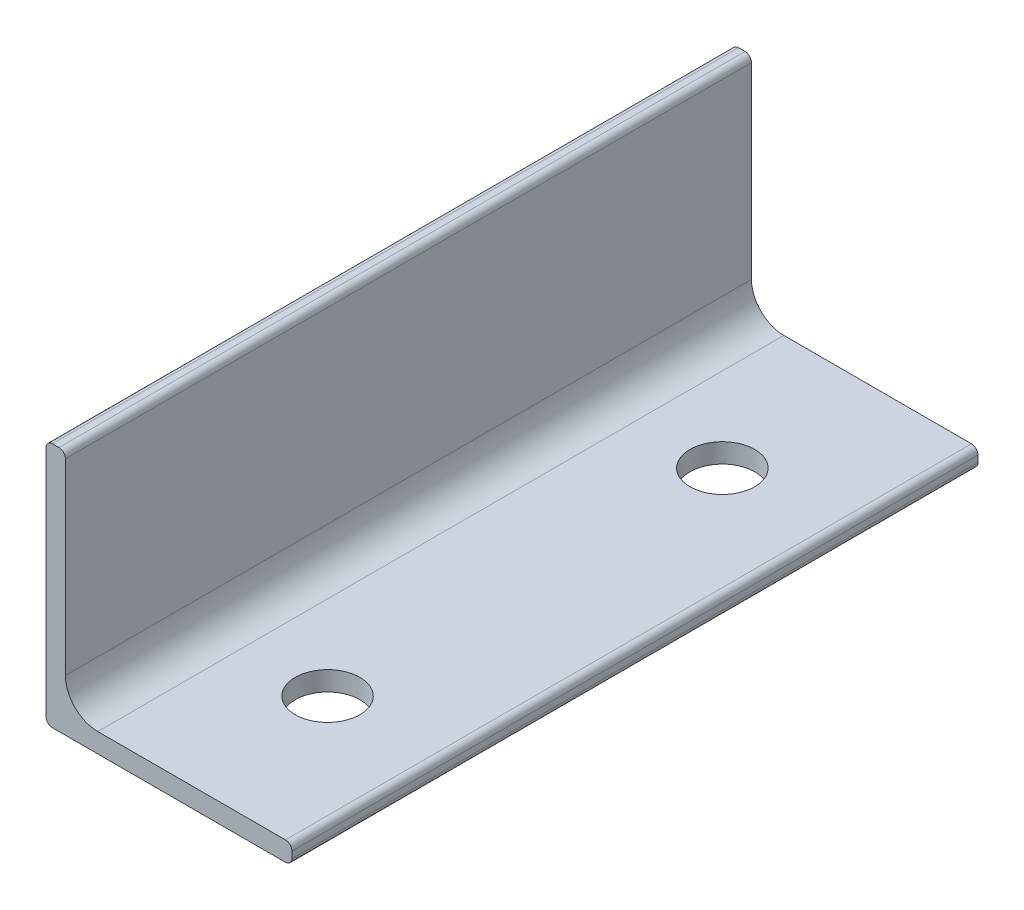
ISO-10303-21;
HEADER;
FILE_DESCRIPTION(('STEP AP214'),'2;1');
FILE_NAME('part.step','',(''),(''),'','','');
FILE_SCHEMA(('AUTOMOTIVE_DESIGN { 1 0 10303 214 1 1 1 1 }'));
ENDSEC;
DATA;
#1=APPLICATION_CONTEXT('core data for automotive mechanical design processes');
#2=APPLICATION_PROTOCOL_DEFINITION('international standard','automotive_design',2000,#1);
#3=PRODUCT_CONTEXT('',#1,'mechanical');
#4=PRODUCT('Part','Part','',(#3));
#5=PRODUCT_RELATED_PRODUCT_CATEGORY('part','',(#4));
#6=PRODUCT_DEFINITION_FORMATION('','',#4);
#7=PRODUCT_DEFINITION_CONTEXT('part definition',#1,'design');
#8=PRODUCT_DEFINITION('design','',#6,#7);
#9=PRODUCT_DEFINITION_SHAPE('','',#8);
#10=(LENGTH_UNIT() NAMED_UNIT(*) SI_UNIT(.MILLI.,.METRE.));
#11=(NAMED_UNIT(*) PLANE_ANGLE_UNIT() SI_UNIT($,.RADIAN.));
#12=(NAMED_UNIT(*) SI_UNIT($,.STERADIAN.) SOLID_ANGLE_UNIT());
#13=UNCERTAINTY_MEASURE_WITH_UNIT(LENGTH_MEASURE(1.E-05),#10,'distance_accuracy_value','');
#14=(GEOMETRIC_REPRESENTATION_CONTEXT(3) GLOBAL_UNCERTAINTY_ASSIGNED_CONTEXT((#13)) GLOBAL_UNIT_ASSIGNED_CONTEXT((#10,
#11,#12)) REPRESENTATION_CONTEXT('',''));
#15=CARTESIAN_POINT('',(0.,0.,0.));
#16=DIRECTION('',(0.,0.,1.));
#17=DIRECTION('',(1.,0.,0.));
#18=AXIS2_PLACEMENT_3D('',#15,#16,#17);
#19=CARTESIAN_POINT('',(8.,8.,53.));
#20=DIRECTION('',(0.,0.,-1.));
#21=DIRECTION('',(-1.,0.,0.));
#22=AXIS2_PLACEMENT_3D('',#19,#20,#21);
#23=CYLINDRICAL_SURFACE('',#22,5.);
#24=CARTESIAN_POINT('',(8.,8.,-53.));
#25=DIRECTION('',(0.,0.,-1.));
#26=DIRECTION('',(1.,0.,0.));
#27=AXIS2_PLACEMENT_3D('',#24,#25,#26);
#28=CIRCLE('',#27,5.);
#29=CARTESIAN_POINT('',(8.00000000000004,3.,-53.));
#30=VERTEX_POINT('',#29);
#31=CARTESIAN_POINT('',(3.,8.00000000000004,-53.));
#32=VERTEX_POINT('',#31);
#33=EDGE_CURVE('E170',#30,#32,#28,.T.);
#34=ORIENTED_EDGE('',*,*,#33,.T.);
#35=DIRECTION('',(0.,0.,-1.));
#36=VECTOR('',#35,1.);
#37=CARTESIAN_POINT('',(3.,8.00000000000004,53.));
#38=LINE('',#37,#36);
#39=CARTESIAN_POINT('',(3.,8.00000000000004,53.));
#40=VERTEX_POINT('',#39);
#41=EDGE_CURVE('E11',#40,#32,#38,.T.);
#42=ORIENTED_EDGE('',*,*,#41,.F.);
#43=CARTESIAN_POINT('',(8.,8.,53.));
#44=DIRECTION('',(0.,0.,-1.));
#45=DIRECTION('',(1.,0.,0.));
#46=AXIS2_PLACEMENT_3D('',#43,#44,#45);
#47=CIRCLE('',#46,5.);
#48=CARTESIAN_POINT('',(8.00000000000004,3.,53.));
#49=VERTEX_POINT('',#48);
#50=EDGE_CURVE('E205',#49,#40,#47,.T.);
#51=ORIENTED_EDGE('',*,*,#50,.F.);
#52=DIRECTION('',(0.,0.,-1.));
#53=VECTOR('',#52,1.);
#54=CARTESIAN_POINT('',(8.00000000000004,3.,53.));
#55=LINE('',#54,#53);
#56=EDGE_CURVE('E166',#49,#30,#55,.T.);
#57=ORIENTED_EDGE('',*,*,#56,.T.);
#58=EDGE_LOOP('',(#34,#42,#51,#57));
#59=FACE_BOUND('',#58,.T.);
#60=ADVANCED_FACE('F45',(#59),#23,.F.);
#61=CARTESIAN_POINT('',(3.,37.,53.));
#62=DIRECTION('',(-1.,0.,0.));
#63=DIRECTION('',(0.,-1.,0.));
#64=AXIS2_PLACEMENT_3D('',#61,#62,#63);
#65=PLANE('',#64);
#66=DIRECTION('',(0.,1.,0.));
#67=VECTOR('',#66,1.);
#68=CARTESIAN_POINT('',(3.,37.,-53.));
#69=LINE('',#68,#67);
#70=CARTESIAN_POINT('',(3.,37.,-53.));
#71=VERTEX_POINT('',#70);
#72=EDGE_CURVE('E174',#32,#71,#69,.T.);
#73=ORIENTED_EDGE('',*,*,#72,.T.);
#74=DIRECTION('',(0.,0.,-1.));
#75=VECTOR('',#74,1.);
#76=CARTESIAN_POINT('',(3.,37.,53.));
#77=LINE('',#76,#75);
#78=CARTESIAN_POINT('',(3.,37.,53.));
#79=VERTEX_POINT('',#78);
#80=EDGE_CURVE('E54',#79,#71,#77,.T.);
#81=ORIENTED_EDGE('',*,*,#80,.F.);
#82=DIRECTION('',(0.,1.,0.));
#83=VECTOR('',#82,1.);
#84=CARTESIAN_POINT('',(3.,37.,53.));
#85=LINE('',#84,#83);
#86=EDGE_CURVE('E117',#40,#79,#85,.T.);
#87=ORIENTED_EDGE('',*,*,#86,.F.);
#88=ORIENTED_EDGE('',*,*,#41,.T.);
#89=EDGE_LOOP('',(#73,#81,#87,#88));
#90=FACE_BOUND('',#89,.T.);
#91=ADVANCED_FACE('F304',(#90),#65,.F.);
#92=CARTESIAN_POINT('',(2.,37.,53.));
#93=DIRECTION('',(0.,0.,-1.));
#94=DIRECTION('',(-1.,0.,0.));
#95=AXIS2_PLACEMENT_3D('',#92,#93,#94);
#96=CYLINDRICAL_SURFACE('',#95,1.);
#97=CARTESIAN_POINT('',(2.,37.,-53.));
#98=DIRECTION('',(0.,0.,1.));
#99=DIRECTION('',(-1.,0.,0.));
#100=AXIS2_PLACEMENT_3D('',#97,#98,#99);
#101=CIRCLE('',#100,1.);
#102=CARTESIAN_POINT('',(1.99999999999999,38.,-53.));
#103=VERTEX_POINT('',#102);
#104=EDGE_CURVE('E178',#71,#103,#101,.T.);
#105=ORIENTED_EDGE('',*,*,#104,.T.);
#106=DIRECTION('',(0.,0.,-1.));
#107=VECTOR('',#106,1.);
#108=CARTESIAN_POINT('',(1.99999999999999,38.,53.));
#109=LINE('',#108,#107);
#110=CARTESIAN_POINT('',(1.99999999999999,38.,53.));
#111=VERTEX_POINT('',#110);
#112=EDGE_CURVE('E232',#111,#103,#109,.T.);
#113=ORIENTED_EDGE('',*,*,#112,.F.);
#114=CARTESIAN_POINT('',(2.,37.,53.));
#115=DIRECTION('',(0.,0.,1.));
#116=DIRECTION('',(-1.,0.,0.));
#117=AXIS2_PLACEMENT_3D('',#114,#115,#116);
#118=CIRCLE('',#117,1.);
#119=EDGE_CURVE('E242',#79,#111,#118,.T.);
#120=ORIENTED_EDGE('',*,*,#119,.F.);
#121=ORIENTED_EDGE('',*,*,#80,.T.);
#122=EDGE_LOOP('',(#105,#113,#120,#121));
#123=FACE_BOUND('',#122,.T.);
#124=ADVANCED_FACE('F240',(#123),#96,.T.);
#125=CARTESIAN_POINT('',(1.00000000000001,38.,53.));
#126=DIRECTION('',(0.,-1.,0.));
#127=DIRECTION('',(0.,0.,-1.));
#128=AXIS2_PLACEMENT_3D('',#125,#126,#127);
#129=PLANE('',#128);
#130=DIRECTION('',(-1.,0.,0.));
#131=VECTOR('',#130,1.);
#132=CARTESIAN_POINT('',(1.00000000000001,38.,-53.));
#133=LINE('',#132,#131);
#134=CARTESIAN_POINT('',(1.00000000000001,38.,-53.));
#135=VERTEX_POINT('',#134);
#136=EDGE_CURVE('E181',#103,#135,#133,.T.);
#137=ORIENTED_EDGE('',*,*,#136,.T.);
#138=DIRECTION('',(0.,0.,-1.));
#139=VECTOR('',#138,1.);
#140=CARTESIAN_POINT('',(1.00000000000001,38.,53.));
#141=LINE('',#140,#139);
#142=CARTESIAN_POINT('',(1.00000000000001,38.,53.));
#143=VERTEX_POINT('',#142);
#144=EDGE_CURVE('E228',#143,#135,#141,.T.);
#145=ORIENTED_EDGE('',*,*,#144,.F.);
#146=DIRECTION('',(-1.,0.,0.));
#147=VECTOR('',#146,1.);
#148=CARTESIAN_POINT('',(1.00000000000001,38.,53.));
#149=LINE('',#148,#147);
#150=EDGE_CURVE('E261',#111,#143,#149,.T.);
#151=ORIENTED_EDGE('',*,*,#150,.F.);
#152=ORIENTED_EDGE('',*,*,#112,.T.);
#153=EDGE_LOOP('',(#137,#145,#151,#152));
#154=FACE_BOUND('',#153,.T.);
#155=ADVANCED_FACE('F251',(#154),#129,.F.);
#156=CARTESIAN_POINT('',(1.,37.,53.));
#157=DIRECTION('',(0.,0.,-1.));
#158=DIRECTION('',(-1.,0.,0.));
#159=AXIS2_PLACEMENT_3D('',#156,#157,#158);
#160=CYLINDRICAL_SURFACE('',#159,1.);
#161=CARTESIAN_POINT('',(1.,37.,-53.));
#162=DIRECTION('',(0.,0.,1.));
#163=DIRECTION('',(-1.,0.,0.));
#164=AXIS2_PLACEMENT_3D('',#161,#162,#163);
#165=CIRCLE('',#164,1.);
#166=CARTESIAN_POINT('',(0.,37.,-53.));
#167=VERTEX_POINT('',#166);
#168=EDGE_CURVE('E184',#135,#167,#165,.T.);
#169=ORIENTED_EDGE('',*,*,#168,.T.);
#170=DIRECTION('',(0.,0.,-1.));
#171=VECTOR('',#170,1.);
#172=CARTESIAN_POINT('',(0.,37.,53.));
#173=LINE('',#172,#171);
#174=CARTESIAN_POINT('',(0.,37.,53.));
#175=VERTEX_POINT('',#174);
#176=EDGE_CURVE('E224',#175,#167,#173,.T.);
#177=ORIENTED_EDGE('',*,*,#176,.F.);
#178=CARTESIAN_POINT('',(1.,37.,53.));
#179=DIRECTION('',(0.,0.,1.));
#180=DIRECTION('',(-1.,0.,0.));
#181=AXIS2_PLACEMENT_3D('',#178,#179,#180);
#182=CIRCLE('',#181,1.);
#183=EDGE_CURVE('E257',#143,#175,#182,.T.);
#184=ORIENTED_EDGE('',*,*,#183,.F.);
#185=ORIENTED_EDGE('',*,*,#144,.T.);
#186=EDGE_LOOP('',(#169,#177,#184,#185));
#187=FACE_BOUND('',#186,.T.);
#188=ADVANCED_FACE('F255',(#187),#160,.T.);
#189=CARTESIAN_POINT('',(0.,1.00000000000001,53.));
#190=DIRECTION('',(1.,0.,0.));
#191=DIRECTION('',(0.,0.,-1.));
#192=AXIS2_PLACEMENT_3D('',#189,#190,#191);
#193=PLANE('',#192);
#194=DIRECTION('',(0.,-1.,0.));
#195=VECTOR('',#194,1.);
#196=CARTESIAN_POINT('',(0.,1.00000000000001,-53.));
#197=LINE('',#196,#195);
#198=CARTESIAN_POINT('',(0.,1.00000000000001,-53.));
#199=VERTEX_POINT('',#198);
#200=EDGE_CURVE('E187',#167,#199,#197,.T.);
#201=ORIENTED_EDGE('',*,*,#200,.T.);
#202=DIRECTION('',(0.,0.,-1.));
#203=VECTOR('',#202,1.);
#204=CARTESIAN_POINT('',(0.,1.00000000000001,53.));
#205=LINE('',#204,#203);
#206=CARTESIAN_POINT('',(0.,1.00000000000001,53.));
#207=VERTEX_POINT('',#206);
#208=EDGE_CURVE('E220',#207,#199,#205,.T.);
#209=ORIENTED_EDGE('',*,*,#208,.F.);
#210=DIRECTION('',(0.,-1.,0.));
#211=VECTOR('',#210,1.);
#212=CARTESIAN_POINT('',(0.,1.00000000000001,53.));
#213=LINE('',#212,#211);
#214=EDGE_CURVE('E260',#175,#207,#213,.T.);
#215=ORIENTED_EDGE('',*,*,#214,.F.);
#216=ORIENTED_EDGE('',*,*,#176,.T.);
#217=EDGE_LOOP('',(#201,#209,#215,#216));
#218=FACE_BOUND('',#217,.T.);
#219=ADVANCED_FACE('F317',(#218),#193,.F.);
#220=CARTESIAN_POINT('',(1.,1.,53.));
#221=DIRECTION('',(0.,0.,-1.));
#222=DIRECTION('',(-1.,0.,0.));
#223=AXIS2_PLACEMENT_3D('',#220,#221,#222);
#224=CYLINDRICAL_SURFACE('',#223,1.);
#225=CARTESIAN_POINT('',(1.,1.,-53.));
#226=DIRECTION('',(0.,0.,1.));
#227=DIRECTION('',(1.,0.,0.));
#228=AXIS2_PLACEMENT_3D('',#225,#226,#227);
#229=CIRCLE('',#228,1.);
#230=CARTESIAN_POINT('',(1.00000000000001,0.,-53.));
#231=VERTEX_POINT('',#230);
#232=EDGE_CURVE('E190',#199,#231,#229,.T.);
#233=ORIENTED_EDGE('',*,*,#232,.T.);
#234=DIRECTION('',(0.,0.,-1.));
#235=VECTOR('',#234,1.);
#236=CARTESIAN_POINT('',(1.00000000000001,0.,53.));
#237=LINE('',#236,#235);
#238=CARTESIAN_POINT('',(1.00000000000001,0.,53.));
#239=VERTEX_POINT('',#238);
#240=EDGE_CURVE('E216',#239,#231,#237,.T.);
#241=ORIENTED_EDGE('',*,*,#240,.F.);
#242=CARTESIAN_POINT('',(1.,1.,53.));
#243=DIRECTION('',(0.,0.,1.));
#244=DIRECTION('',(1.,0.,0.));
#245=AXIS2_PLACEMENT_3D('',#242,#243,#244);
#246=CIRCLE('',#245,1.);
#247=EDGE_CURVE('E265',#207,#239,#246,.T.);
#248=ORIENTED_EDGE('',*,*,#247,.F.);
#249=ORIENTED_EDGE('',*,*,#208,.T.);
#250=EDGE_LOOP('',(#233,#241,#248,#249));
#251=FACE_BOUND('',#250,.T.);
#252=ADVANCED_FACE('F320',(#251),#224,.T.);
#253=CARTESIAN_POINT('',(37.,0.,53.));
#254=DIRECTION('',(0.,1.,0.));
#255=DIRECTION('',(0.,0.,1.));
#256=AXIS2_PLACEMENT_3D('',#253,#254,#255);
#257=PLANE('',#256);
#258=CARTESIAN_POINT('',(21.,0.,-30.5));
#259=DIRECTION('',(0.,1.,0.));
#260=DIRECTION('',(0.,0.,1.));
#261=AXIS2_PLACEMENT_3D('',#258,#259,#260);
#262=CIRCLE('',#261,5.);
#263=CARTESIAN_POINT('',(21.,0.,-25.5));
#264=VERTEX_POINT('',#263);
#265=EDGE_CURVE('E175',#264,#264,#262,.T.);
#266=ORIENTED_EDGE('',*,*,#265,.T.);
#267=EDGE_LOOP('',(#266));
#268=FACE_BOUND('',#267,.T.);
#269=CARTESIAN_POINT('',(21.,0.,30.5));
#270=DIRECTION('',(0.,1.,0.));
#271=DIRECTION('',(0.,0.,1.));
#272=AXIS2_PLACEMENT_3D('',#269,#270,#271);
#273=CIRCLE('',#272,5.);
#274=CARTESIAN_POINT('',(21.,0.,35.5));
#275=VERTEX_POINT('',#274);
#276=EDGE_CURVE('E407',#275,#275,#273,.T.);
#277=ORIENTED_EDGE('',*,*,#276,.T.);
#278=EDGE_LOOP('',(#277));
#279=FACE_BOUND('',#278,.T.);
#280=DIRECTION('',(1.,0.,0.));
#281=VECTOR('',#280,1.);
#282=CARTESIAN_POINT('',(37.,0.,-53.));
#283=LINE('',#282,#281);
#284=CARTESIAN_POINT('',(37.,0.,-53.));
#285=VERTEX_POINT('',#284);
#286=EDGE_CURVE('E193',#231,#285,#283,.T.);
#287=ORIENTED_EDGE('',*,*,#286,.T.);
#288=DIRECTION('',(0.,0.,-1.));
#289=VECTOR('',#288,1.);
#290=CARTESIAN_POINT('',(37.,0.,53.));
#291=LINE('',#290,#289);
#292=CARTESIAN_POINT('',(37.,0.,53.));
#293=VERTEX_POINT('',#292);
#294=EDGE_CURVE('E212',#293,#285,#291,.T.);
#295=ORIENTED_EDGE('',*,*,#294,.F.);
#296=DIRECTION('',(1.,0.,0.));
#297=VECTOR('',#296,1.);
#298=CARTESIAN_POINT('',(37.,0.,53.));
#299=LINE('',#298,#297);
#300=EDGE_CURVE('E272',#239,#293,#299,.T.);
#301=ORIENTED_EDGE('',*,*,#300,.F.);
#302=ORIENTED_EDGE('',*,*,#240,.T.);
#303=EDGE_LOOP('',(#287,#295,#301,#302));
#304=FACE_BOUND('',#303,.T.);
#305=ADVANCED_FACE('F280',(#268,#279,#304),#257,.F.);
#306=CARTESIAN_POINT('',(37.,1.,53.));
#307=DIRECTION('',(0.,0.,-1.));
#308=DIRECTION('',(-1.,0.,0.));
#309=AXIS2_PLACEMENT_3D('',#306,#307,#308);
#310=CYLINDRICAL_SURFACE('',#309,1.);
#311=CARTESIAN_POINT('',(37.,1.,-53.));
#312=DIRECTION('',(0.,0.,1.));
#313=DIRECTION('',(-1.,0.,0.));
#314=AXIS2_PLACEMENT_3D('',#311,#312,#313);
#315=CIRCLE('',#314,1.);
#316=CARTESIAN_POINT('',(38.,1.00000000000001,-53.));
#317=VERTEX_POINT('',#316);
#318=EDGE_CURVE('E196',#285,#317,#315,.T.);
#319=ORIENTED_EDGE('',*,*,#318,.T.);
#320=DIRECTION('',(0.,0.,-1.));
#321=VECTOR('',#320,1.);
#322=CARTESIAN_POINT('',(38.,1.00000000000001,53.));
#323=LINE('',#322,#321);
#324=CARTESIAN_POINT('',(38.,1.00000000000001,53.));
#325=VERTEX_POINT('',#324);
#326=EDGE_CURVE('E159',#325,#317,#323,.T.);
#327=ORIENTED_EDGE('',*,*,#326,.F.);
#328=CARTESIAN_POINT('',(37.,1.,53.));
#329=DIRECTION('',(0.,0.,1.));
#330=DIRECTION('',(-1.,0.,0.));
#331=AXIS2_PLACEMENT_3D('',#328,#329,#330);
#332=CIRCLE('',#331,1.);
#333=EDGE_CURVE('E148',#293,#325,#332,.T.);
#334=ORIENTED_EDGE('',*,*,#333,.F.);
#335=ORIENTED_EDGE('',*,*,#294,.T.);
#336=EDGE_LOOP('',(#319,#327,#334,#335));
#337=FACE_BOUND('',#336,.T.);
#338=ADVANCED_FACE('F284',(#337),#310,.T.);
#339=CARTESIAN_POINT('',(38.,1.99999999999999,53.));
#340=DIRECTION('',(-1.,0.,0.));
#341=DIRECTION('',(0.,0.,1.));
#342=AXIS2_PLACEMENT_3D('',#339,#340,#341);
#343=PLANE('',#342);
#344=DIRECTION('',(0.,1.,0.));
#345=VECTOR('',#344,1.);
#346=CARTESIAN_POINT('',(38.,1.99999999999999,-53.));
#347=LINE('',#346,#345);
#348=CARTESIAN_POINT('',(38.,1.99999999999999,-53.));
#349=VERTEX_POINT('',#348);
#350=EDGE_CURVE('E157',#317,#349,#347,.T.);
#351=ORIENTED_EDGE('',*,*,#350,.T.);
#352=DIRECTION('',(0.,0.,-1.));
#353=VECTOR('',#352,1.);
#354=CARTESIAN_POINT('',(38.,1.99999999999999,53.));
#355=LINE('',#354,#353);
#356=CARTESIAN_POINT('',(38.,1.99999999999999,53.));
#357=VERTEX_POINT('',#356);
#358=EDGE_CURVE('E154',#357,#349,#355,.T.);
#359=ORIENTED_EDGE('',*,*,#358,.F.);
#360=DIRECTION('',(0.,1.,0.));
#361=VECTOR('',#360,1.);
#362=CARTESIAN_POINT('',(38.,1.99999999999999,53.));
#363=LINE('',#362,#361);
#364=EDGE_CURVE('E142',#325,#357,#363,.T.);
#365=ORIENTED_EDGE('',*,*,#364,.F.);
#366=ORIENTED_EDGE('',*,*,#326,.T.);
#367=EDGE_LOOP('',(#351,#359,#365,#366));
#368=FACE_BOUND('',#367,.T.);
#369=ADVANCED_FACE('F155',(#368),#343,.F.);
#370=CARTESIAN_POINT('',(37.,2.,53.));
#371=DIRECTION('',(0.,0.,-1.));
#372=DIRECTION('',(-1.,0.,0.));
#373=AXIS2_PLACEMENT_3D('',#370,#371,#372);
#374=CYLINDRICAL_SURFACE('',#373,1.);
#375=CARTESIAN_POINT('',(37.,2.,-53.));
#376=DIRECTION('',(0.,0.,1.));
#377=DIRECTION('',(-1.,0.,0.));
#378=AXIS2_PLACEMENT_3D('',#375,#376,#377);
#379=CIRCLE('',#378,1.);
#380=CARTESIAN_POINT('',(37.,3.,-53.));
#381=VERTEX_POINT('',#380);
#382=EDGE_CURVE('E103',#349,#381,#379,.T.);
#383=ORIENTED_EDGE('',*,*,#382,.T.);
#384=DIRECTION('',(0.,0.,-1.));
#385=VECTOR('',#384,1.);
#386=CARTESIAN_POINT('',(37.,3.,53.));
#387=LINE('',#386,#385);
#388=CARTESIAN_POINT('',(37.,3.,53.));
#389=VERTEX_POINT('',#388);
#390=EDGE_CURVE('E160',#389,#381,#387,.T.);
#391=ORIENTED_EDGE('',*,*,#390,.F.);
#392=CARTESIAN_POINT('',(37.,2.,53.));
#393=DIRECTION('',(0.,0.,1.));
#394=DIRECTION('',(-1.,0.,0.));
#395=AXIS2_PLACEMENT_3D('',#392,#393,#394);
#396=CIRCLE('',#395,1.);
#397=EDGE_CURVE('E146',#357,#389,#396,.T.);
#398=ORIENTED_EDGE('',*,*,#397,.F.);
#399=ORIENTED_EDGE('',*,*,#358,.T.);
#400=EDGE_LOOP('',(#383,#391,#398,#399));
#401=FACE_BOUND('',#400,.T.);
#402=ADVANCED_FACE('F162',(#401),#374,.T.);
#403=CARTESIAN_POINT('',(8.00000000000004,3.,53.));
#404=DIRECTION('',(0.,-1.,0.));
#405=DIRECTION('',(0.,0.,-1.));
#406=AXIS2_PLACEMENT_3D('',#403,#404,#405);
#407=PLANE('',#406);
#408=CARTESIAN_POINT('',(21.,3.,-30.5));
#409=DIRECTION('',(0.,1.,0.));
#410=DIRECTION('',(0.,0.,1.));
#411=AXIS2_PLACEMENT_3D('',#408,#409,#410);
#412=CIRCLE('',#411,5.);
#413=CARTESIAN_POINT('',(21.,3.,-25.5));
#414=VERTEX_POINT('',#413);
#415=EDGE_CURVE('E399',#414,#414,#412,.T.);
#416=ORIENTED_EDGE('',*,*,#415,.F.);
#417=EDGE_LOOP('',(#416));
#418=FACE_BOUND('',#417,.T.);
#419=CARTESIAN_POINT('',(21.,3.,30.5));
#420=DIRECTION('',(0.,1.,0.));
#421=DIRECTION('',(0.,0.,1.));
#422=AXIS2_PLACEMENT_3D('',#419,#420,#421);
#423=CIRCLE('',#422,5.);
#424=CARTESIAN_POINT('',(21.,3.,35.5));
#425=VERTEX_POINT('',#424);
#426=EDGE_CURVE('E401',#425,#425,#423,.T.);
#427=ORIENTED_EDGE('',*,*,#426,.F.);
#428=EDGE_LOOP('',(#427));
#429=FACE_BOUND('',#428,.T.);
#430=DIRECTION('',(-1.,0.,0.));
#431=VECTOR('',#430,1.);
#432=CARTESIAN_POINT('',(8.00000000000004,3.,-53.));
#433=LINE('',#432,#431);
#434=EDGE_CURVE('E109',#381,#30,#433,.T.);
#435=ORIENTED_EDGE('',*,*,#434,.T.);
#436=ORIENTED_EDGE('',*,*,#56,.F.);
#437=DIRECTION('',(-1.,0.,0.));
#438=VECTOR('',#437,1.);
#439=CARTESIAN_POINT('',(8.00000000000004,3.,53.));
#440=LINE('',#439,#438);
#441=EDGE_CURVE('E62',#389,#49,#440,.T.);
#442=ORIENTED_EDGE('',*,*,#441,.F.);
#443=ORIENTED_EDGE('',*,*,#390,.T.);
#444=EDGE_LOOP('',(#435,#436,#442,#443));
#445=FACE_BOUND('',#444,.T.);
#446=ADVANCED_FACE('F288',(#418,#429,#445),#407,.F.);
#447=CARTESIAN_POINT('',(8.,8.,53.));
#448=DIRECTION('',(0.,0.,1.));
#449=DIRECTION('',(1.,0.,0.));
#450=AXIS2_PLACEMENT_3D('',#447,#448,#449);
#451=PLANE('',#450);
#452=ORIENTED_EDGE('',*,*,#50,.T.);
#453=ORIENTED_EDGE('',*,*,#86,.T.);
#454=ORIENTED_EDGE('',*,*,#119,.T.);
#455=ORIENTED_EDGE('',*,*,#150,.T.);
#456=ORIENTED_EDGE('',*,*,#183,.T.);
#457=ORIENTED_EDGE('',*,*,#214,.T.);
#458=ORIENTED_EDGE('',*,*,#247,.T.);
#459=ORIENTED_EDGE('',*,*,#300,.T.);
#460=ORIENTED_EDGE('',*,*,#333,.T.);
#461=ORIENTED_EDGE('',*,*,#364,.T.);
#462=ORIENTED_EDGE('',*,*,#397,.T.);
#463=ORIENTED_EDGE('',*,*,#441,.T.);
#464=EDGE_LOOP('',(#452,#453,#454,#455,#456,#457,#458,#459,#460,#461,#462,#463));
#465=FACE_BOUND('',#464,.T.);
#466=ADVANCED_FACE('F144',(#465),#451,.T.);
#467=CARTESIAN_POINT('',(8.,8.,-53.));
#468=DIRECTION('',(0.,0.,1.));
#469=DIRECTION('',(1.,0.,0.));
#470=AXIS2_PLACEMENT_3D('',#467,#468,#469);
#471=PLANE('',#470);
#472=ORIENTED_EDGE('',*,*,#33,.F.);
#473=ORIENTED_EDGE('',*,*,#434,.F.);
#474=ORIENTED_EDGE('',*,*,#382,.F.);
#475=ORIENTED_EDGE('',*,*,#350,.F.);
#476=ORIENTED_EDGE('',*,*,#318,.F.);
#477=ORIENTED_EDGE('',*,*,#286,.F.);
#478=ORIENTED_EDGE('',*,*,#232,.F.);
#479=ORIENTED_EDGE('',*,*,#200,.F.);
#480=ORIENTED_EDGE('',*,*,#168,.F.);
#481=ORIENTED_EDGE('',*,*,#136,.F.);
#482=ORIENTED_EDGE('',*,*,#104,.F.);
#483=ORIENTED_EDGE('',*,*,#72,.F.);
#484=EDGE_LOOP('',(#472,#473,#474,#475,#476,#477,#478,#479,#480,#481,#482,#483));
#485=FACE_BOUND('',#484,.T.);
#486=ADVANCED_FACE('F246',(#485),#471,.F.);
#487=CARTESIAN_POINT('',(21.,0.,30.5));
#488=DIRECTION('',(0.,1.,0.));
#489=DIRECTION('',(0.,0.,1.));
#490=AXIS2_PLACEMENT_3D('',#487,#488,#489);
#491=CYLINDRICAL_SURFACE('',#490,5.);
#492=ORIENTED_EDGE('',*,*,#276,.F.);
#493=EDGE_LOOP('',(#492));
#494=FACE_BOUND('',#493,.T.);
#495=ORIENTED_EDGE('',*,*,#426,.T.);
#496=EDGE_LOOP('',(#495));
#497=FACE_BOUND('',#496,.T.);
#498=ADVANCED_FACE('F350',(#494,#497),#491,.F.);
#499=CARTESIAN_POINT('',(21.,0.,-30.5));
#500=DIRECTION('',(0.,1.,0.));
#501=DIRECTION('',(0.,0.,1.));
#502=AXIS2_PLACEMENT_3D('',#499,#500,#501);
#503=CYLINDRICAL_SURFACE('',#502,5.);
#504=ORIENTED_EDGE('',*,*,#265,.F.);
#505=EDGE_LOOP('',(#504));
#506=FACE_BOUND('',#505,.T.);
#507=ORIENTED_EDGE('',*,*,#415,.T.);
#508=EDGE_LOOP('',(#507));
#509=FACE_BOUND('',#508,.T.);
#510=ADVANCED_FACE('F381',(#506,#509),#503,.F.);
#511=CLOSED_SHELL('',(#60,#91,#124,#155,#188,#219,#252,#305,#338,#369,#402,#446,#466,#486,#498,#510));
#512=MANIFOLD_SOLID_BREP('B2',#511);
#513=ADVANCED_BREP_SHAPE_REPRESENTATION('',(#18,#512),#14);
#514=SHAPE_DEFINITION_REPRESENTATION(#9,#513);
ENDSEC;
END-ISO-10303-21;
